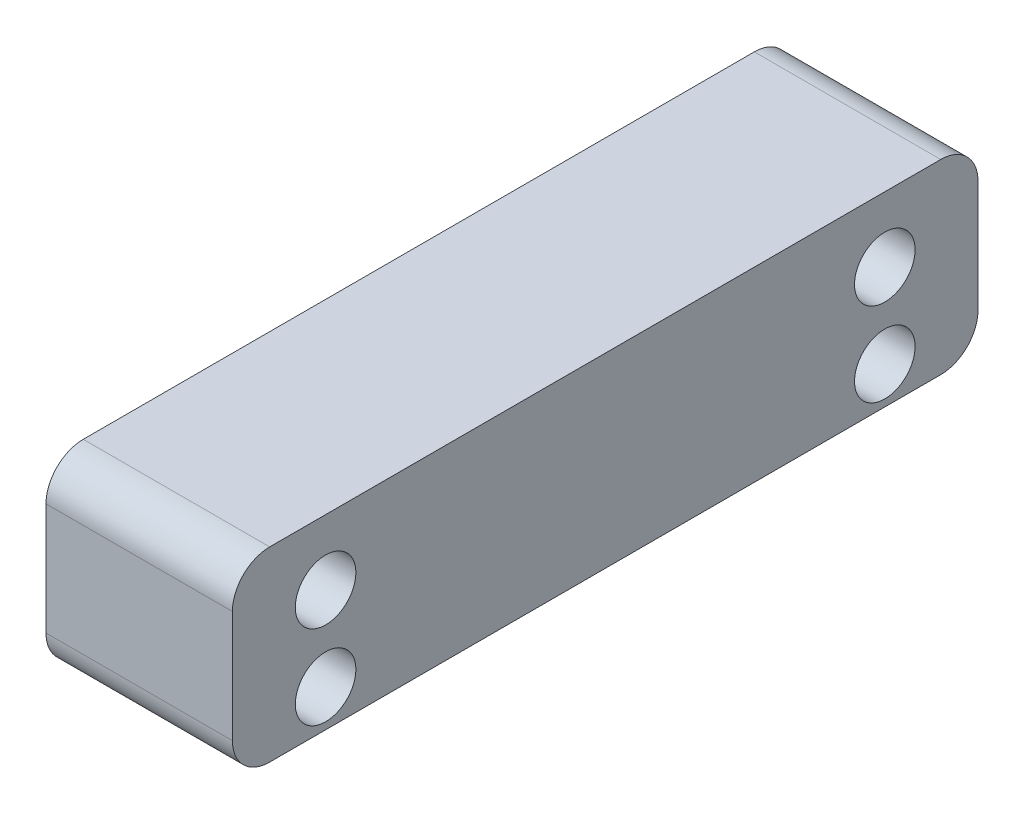
ISO-10303-21;
HEADER;
FILE_DESCRIPTION(('STEP AP214'),'2;1');
FILE_NAME('part.step','',(''),(''),'','','');
FILE_SCHEMA(('AUTOMOTIVE_DESIGN { 1 0 10303 214 1 1 1 1 }'));
ENDSEC;
DATA;
#1=APPLICATION_CONTEXT('core data for automotive mechanical design processes');
#2=APPLICATION_PROTOCOL_DEFINITION('international standard','automotive_design',2000,#1);
#3=PRODUCT_CONTEXT('',#1,'mechanical');
#4=PRODUCT('Part','Part','',(#3));
#5=PRODUCT_RELATED_PRODUCT_CATEGORY('part','',(#4));
#6=PRODUCT_DEFINITION_FORMATION('','',#4);
#7=PRODUCT_DEFINITION_CONTEXT('part definition',#1,'design');
#8=PRODUCT_DEFINITION('design','',#6,#7);
#9=PRODUCT_DEFINITION_SHAPE('','',#8);
#10=(LENGTH_UNIT() NAMED_UNIT(*) SI_UNIT(.MILLI.,.METRE.));
#11=(NAMED_UNIT(*) PLANE_ANGLE_UNIT() SI_UNIT($,.RADIAN.));
#12=(NAMED_UNIT(*) SI_UNIT($,.STERADIAN.) SOLID_ANGLE_UNIT());
#13=UNCERTAINTY_MEASURE_WITH_UNIT(LENGTH_MEASURE(1.E-05),#10,'distance_accuracy_value','');
#14=(GEOMETRIC_REPRESENTATION_CONTEXT(3) GLOBAL_UNCERTAINTY_ASSIGNED_CONTEXT((#13)) GLOBAL_UNIT_ASSIGNED_CONTEXT((#10,
#11,#12)) REPRESENTATION_CONTEXT('',''));
#15=CARTESIAN_POINT('',(0.,0.,0.));
#16=DIRECTION('',(0.,0.,1.));
#17=DIRECTION('',(1.,0.,0.));
#18=AXIS2_PLACEMENT_3D('',#15,#16,#17);
#19=CARTESIAN_POINT('',(-34.,0.,0.));
#20=DIRECTION('',(1.,0.,0.));
#21=DIRECTION('',(0.,0.,-1.));
#22=AXIS2_PLACEMENT_3D('',#19,#20,#21);
#23=PLANE('',#22);
#24=CARTESIAN_POINT('',(-34.,59.5,89.6966991411007));
#25=DIRECTION('',(1.,0.,0.));
#26=DIRECTION('',(0.,0.,-1.));
#27=AXIS2_PLACEMENT_3D('',#24,#25,#26);
#28=CIRCLE('',#27,3.25000000000001);
#29=CARTESIAN_POINT('',(-34.,59.5,86.4466991411007));
#30=VERTEX_POINT('',#29);
#31=EDGE_CURVE('E225',#30,#30,#28,.T.);
#32=ORIENTED_EDGE('',*,*,#31,.F.);
#33=EDGE_LOOP('',(#32));
#34=FACE_BOUND('',#33,.T.);
#35=CARTESIAN_POINT('',(-34.,50.5,89.6966991411007));
#36=DIRECTION('',(1.,0.,0.));
#37=DIRECTION('',(0.,0.,-1.));
#38=AXIS2_PLACEMENT_3D('',#35,#36,#37);
#39=CIRCLE('',#38,3.25000000000001);
#40=CARTESIAN_POINT('',(-34.,50.5,86.4466991411007));
#41=VERTEX_POINT('',#40);
#42=EDGE_CURVE('E212',#41,#41,#39,.T.);
#43=ORIENTED_EDGE('',*,*,#42,.F.);
#44=EDGE_LOOP('',(#43));
#45=FACE_BOUND('',#44,.T.);
#46=DIRECTION('',(0.,1.,0.));
#47=VECTOR('',#46,1.);
#48=CARTESIAN_POINT('',(-34.,45.,19.6966991411007));
#49=LINE('',#48,#47);
#50=CARTESIAN_POINT('',(-34.,50.5,19.6966991411007));
#51=VERTEX_POINT('',#50);
#52=CARTESIAN_POINT('',(-34.,62.5,19.6966991411007));
#53=VERTEX_POINT('',#52);
#54=EDGE_CURVE('E180',#51,#53,#49,.T.);
#55=ORIENTED_EDGE('',*,*,#54,.T.);
#56=CARTESIAN_POINT('',(-34.,62.5,23.6966991411007));
#57=DIRECTION('',(1.,0.,0.));
#58=DIRECTION('',(0.,0.,-1.));
#59=AXIS2_PLACEMENT_3D('',#56,#57,#58);
#60=CIRCLE('',#59,4.);
#61=CARTESIAN_POINT('',(-34.,66.5,23.6966991411007));
#62=VERTEX_POINT('',#61);
#63=EDGE_CURVE('E197',#53,#62,#60,.T.);
#64=ORIENTED_EDGE('',*,*,#63,.T.);
#65=DIRECTION('',(0.,0.,1.));
#66=VECTOR('',#65,1.);
#67=CARTESIAN_POINT('',(-34.,66.5,19.6966991411007));
#68=LINE('',#67,#66);
#69=CARTESIAN_POINT('',(-34.,66.5,95.6966991411007));
#70=VERTEX_POINT('',#69);
#71=EDGE_CURVE('E163',#62,#70,#68,.T.);
#72=ORIENTED_EDGE('',*,*,#71,.T.);
#73=CARTESIAN_POINT('',(-34.,62.5,95.6966991411007));
#74=DIRECTION('',(1.,0.,0.));
#75=DIRECTION('',(0.,0.,-1.));
#76=AXIS2_PLACEMENT_3D('',#73,#74,#75);
#77=CIRCLE('',#76,4.);
#78=CARTESIAN_POINT('',(-34.,62.5,99.6966991411007));
#79=VERTEX_POINT('',#78);
#80=EDGE_CURVE('E192',#70,#79,#77,.T.);
#81=ORIENTED_EDGE('',*,*,#80,.T.);
#82=DIRECTION('',(0.,-1.,0.));
#83=VECTOR('',#82,1.);
#84=CARTESIAN_POINT('',(-34.,65.,99.6966991411007));
#85=LINE('',#84,#83);
#86=CARTESIAN_POINT('',(-34.,50.5,99.6966991411007));
#87=VERTEX_POINT('',#86);
#88=EDGE_CURVE('E170',#79,#87,#85,.T.);
#89=ORIENTED_EDGE('',*,*,#88,.T.);
#90=CARTESIAN_POINT('',(-34.,50.5,95.6966991411007));
#91=DIRECTION('',(1.,0.,0.));
#92=DIRECTION('',(0.,0.,-1.));
#93=AXIS2_PLACEMENT_3D('',#90,#91,#92);
#94=CIRCLE('',#93,4.);
#95=CARTESIAN_POINT('',(-34.,46.5,95.6966991411007));
#96=VERTEX_POINT('',#95);
#97=EDGE_CURVE('E99',#87,#96,#94,.T.);
#98=ORIENTED_EDGE('',*,*,#97,.T.);
#99=DIRECTION('',(0.,0.,-1.));
#100=VECTOR('',#99,1.);
#101=CARTESIAN_POINT('',(-34.,46.5,99.6966991411007));
#102=LINE('',#101,#100);
#103=CARTESIAN_POINT('',(-34.,46.5,23.6966991411007));
#104=VERTEX_POINT('',#103);
#105=EDGE_CURVE('E173',#96,#104,#102,.T.);
#106=ORIENTED_EDGE('',*,*,#105,.T.);
#107=CARTESIAN_POINT('',(-34.,50.5,23.6966991411007));
#108=DIRECTION('',(1.,0.,0.));
#109=DIRECTION('',(0.,0.,-1.));
#110=AXIS2_PLACEMENT_3D('',#107,#108,#109);
#111=CIRCLE('',#110,4.);
#112=EDGE_CURVE('E195',#104,#51,#111,.T.);
#113=ORIENTED_EDGE('',*,*,#112,.T.);
#114=EDGE_LOOP('',(#55,#64,#72,#81,#89,#98,#106,#113));
#115=FACE_BOUND('',#114,.T.);
#116=CARTESIAN_POINT('',(-34.,59.5,29.6966991411007));
#117=DIRECTION('',(1.,0.,0.));
#118=DIRECTION('',(0.,0.,-1.));
#119=AXIS2_PLACEMENT_3D('',#116,#117,#118);
#120=CIRCLE('',#119,3.25);
#121=CARTESIAN_POINT('',(-34.,59.5,26.4466991411007));
#122=VERTEX_POINT('',#121);
#123=EDGE_CURVE('E220',#122,#122,#120,.T.);
#124=ORIENTED_EDGE('',*,*,#123,.F.);
#125=EDGE_LOOP('',(#124));
#126=FACE_BOUND('',#125,.T.);
#127=CARTESIAN_POINT('',(-34.,50.5,29.6966991411007));
#128=DIRECTION('',(1.,0.,0.));
#129=DIRECTION('',(0.,0.,-1.));
#130=AXIS2_PLACEMENT_3D('',#127,#128,#129);
#131=CIRCLE('',#130,3.25);
#132=CARTESIAN_POINT('',(-34.,50.5,26.4466991411007));
#133=VERTEX_POINT('',#132);
#134=EDGE_CURVE('E231',#133,#133,#131,.T.);
#135=ORIENTED_EDGE('',*,*,#134,.F.);
#136=EDGE_LOOP('',(#135));
#137=FACE_BOUND('',#136,.T.);
#138=ADVANCED_FACE('F77',(#34,#45,#115,#126,#137),#23,.T.);
#139=CARTESIAN_POINT('',(-54.,0.,0.));
#140=DIRECTION('',(1.,0.,0.));
#141=DIRECTION('',(0.,0.,-1.));
#142=AXIS2_PLACEMENT_3D('',#139,#140,#141);
#143=PLANE('',#142);
#144=DIRECTION('',(0.,0.,1.));
#145=VECTOR('',#144,1.);
#146=CARTESIAN_POINT('',(-54.,66.5,19.6966991411007));
#147=LINE('',#146,#145);
#148=CARTESIAN_POINT('',(-54.,66.5,23.6966991411007));
#149=VERTEX_POINT('',#148);
#150=CARTESIAN_POINT('',(-54.,66.5,95.6966991411007));
#151=VERTEX_POINT('',#150);
#152=EDGE_CURVE('E160',#149,#151,#147,.T.);
#153=ORIENTED_EDGE('',*,*,#152,.F.);
#154=CARTESIAN_POINT('',(-54.,62.5,23.6966991411007));
#155=DIRECTION('',(1.,0.,0.));
#156=DIRECTION('',(0.,0.,-1.));
#157=AXIS2_PLACEMENT_3D('',#154,#155,#156);
#158=CIRCLE('',#157,4.);
#159=CARTESIAN_POINT('',(-54.,62.5,19.6966991411007));
#160=VERTEX_POINT('',#159);
#161=EDGE_CURVE('E143',#149,#160,#158,.F.);
#162=ORIENTED_EDGE('',*,*,#161,.T.);
#163=DIRECTION('',(0.,1.,0.));
#164=VECTOR('',#163,1.);
#165=CARTESIAN_POINT('',(-54.,45.,19.6966991411007));
#166=LINE('',#165,#164);
#167=CARTESIAN_POINT('',(-54.,50.5,19.6966991411007));
#168=VERTEX_POINT('',#167);
#169=EDGE_CURVE('E171',#168,#160,#166,.T.);
#170=ORIENTED_EDGE('',*,*,#169,.F.);
#171=CARTESIAN_POINT('',(-54.,50.5,23.6966991411007));
#172=DIRECTION('',(1.,0.,0.));
#173=DIRECTION('',(0.,0.,-1.));
#174=AXIS2_PLACEMENT_3D('',#171,#172,#173);
#175=CIRCLE('',#174,4.);
#176=CARTESIAN_POINT('',(-54.,46.5,23.6966991411007));
#177=VERTEX_POINT('',#176);
#178=EDGE_CURVE('E154',#168,#177,#175,.F.);
#179=ORIENTED_EDGE('',*,*,#178,.T.);
#180=DIRECTION('',(0.,0.,-1.));
#181=VECTOR('',#180,1.);
#182=CARTESIAN_POINT('',(-54.,46.5,99.6966991411007));
#183=LINE('',#182,#181);
#184=CARTESIAN_POINT('',(-54.,46.5,95.6966991411007));
#185=VERTEX_POINT('',#184);
#186=EDGE_CURVE('E175',#185,#177,#183,.T.);
#187=ORIENTED_EDGE('',*,*,#186,.F.);
#188=CARTESIAN_POINT('',(-54.,50.5,95.6966991411007));
#189=DIRECTION('',(1.,0.,0.));
#190=DIRECTION('',(0.,0.,-1.));
#191=AXIS2_PLACEMENT_3D('',#188,#189,#190);
#192=CIRCLE('',#191,4.);
#193=CARTESIAN_POINT('',(-54.,50.5,99.6966991411007));
#194=VERTEX_POINT('',#193);
#195=EDGE_CURVE('E186',#185,#194,#192,.F.);
#196=ORIENTED_EDGE('',*,*,#195,.T.);
#197=DIRECTION('',(0.,-1.,0.));
#198=VECTOR('',#197,1.);
#199=CARTESIAN_POINT('',(-54.,65.,99.6966991411007));
#200=LINE('',#199,#198);
#201=CARTESIAN_POINT('',(-54.,62.5,99.6966991411007));
#202=VERTEX_POINT('',#201);
#203=EDGE_CURVE('E182',#202,#194,#200,.T.);
#204=ORIENTED_EDGE('',*,*,#203,.F.);
#205=CARTESIAN_POINT('',(-54.,62.5,95.6966991411007));
#206=DIRECTION('',(1.,0.,0.));
#207=DIRECTION('',(0.,0.,-1.));
#208=AXIS2_PLACEMENT_3D('',#205,#206,#207);
#209=CIRCLE('',#208,4.);
#210=EDGE_CURVE('E164',#202,#151,#209,.F.);
#211=ORIENTED_EDGE('',*,*,#210,.T.);
#212=EDGE_LOOP('',(#153,#162,#170,#179,#187,#196,#204,#211));
#213=FACE_BOUND('',#212,.T.);
#214=CARTESIAN_POINT('',(-54.,50.5,89.6966991411007));
#215=DIRECTION('',(1.,0.,0.));
#216=DIRECTION('',(0.,0.,-1.));
#217=AXIS2_PLACEMENT_3D('',#214,#215,#216);
#218=CIRCLE('',#217,3.25000000000001);
#219=CARTESIAN_POINT('',(-54.,50.5,86.4466991411007));
#220=VERTEX_POINT('',#219);
#221=EDGE_CURVE('E214',#220,#220,#218,.T.);
#222=ORIENTED_EDGE('',*,*,#221,.T.);
#223=EDGE_LOOP('',(#222));
#224=FACE_BOUND('',#223,.T.);
#225=CARTESIAN_POINT('',(-54.,59.5,29.6966991411007));
#226=DIRECTION('',(1.,0.,0.));
#227=DIRECTION('',(0.,0.,-1.));
#228=AXIS2_PLACEMENT_3D('',#225,#226,#227);
#229=CIRCLE('',#228,3.25);
#230=CARTESIAN_POINT('',(-54.,59.5,26.4466991411007));
#231=VERTEX_POINT('',#230);
#232=EDGE_CURVE('E222',#231,#231,#229,.T.);
#233=ORIENTED_EDGE('',*,*,#232,.T.);
#234=EDGE_LOOP('',(#233));
#235=FACE_BOUND('',#234,.T.);
#236=CARTESIAN_POINT('',(-54.,59.5,89.6966991411007));
#237=DIRECTION('',(1.,0.,0.));
#238=DIRECTION('',(0.,0.,-1.));
#239=AXIS2_PLACEMENT_3D('',#236,#237,#238);
#240=CIRCLE('',#239,3.25000000000001);
#241=CARTESIAN_POINT('',(-54.,59.5,86.4466991411007));
#242=VERTEX_POINT('',#241);
#243=EDGE_CURVE('E228',#242,#242,#240,.T.);
#244=ORIENTED_EDGE('',*,*,#243,.T.);
#245=EDGE_LOOP('',(#244));
#246=FACE_BOUND('',#245,.T.);
#247=CARTESIAN_POINT('',(-54.,50.5,29.6966991411007));
#248=DIRECTION('',(1.,0.,0.));
#249=DIRECTION('',(0.,0.,-1.));
#250=AXIS2_PLACEMENT_3D('',#247,#248,#249);
#251=CIRCLE('',#250,3.25);
#252=CARTESIAN_POINT('',(-54.,50.5,26.4466991411007));
#253=VERTEX_POINT('',#252);
#254=EDGE_CURVE('E234',#253,#253,#251,.T.);
#255=ORIENTED_EDGE('',*,*,#254,.T.);
#256=EDGE_LOOP('',(#255));
#257=FACE_BOUND('',#256,.T.);
#258=ADVANCED_FACE('F167',(#213,#224,#235,#246,#257),#143,.F.);
#259=CARTESIAN_POINT('',(-34.,65.,99.6966991411007));
#260=DIRECTION('',(0.,0.,-1.));
#261=DIRECTION('',(-1.,0.,0.));
#262=AXIS2_PLACEMENT_3D('',#259,#260,#261);
#263=PLANE('',#262);
#264=ORIENTED_EDGE('',*,*,#203,.T.);
#265=DIRECTION('',(-1.,0.,0.));
#266=VECTOR('',#265,1.);
#267=CARTESIAN_POINT('',(-34.,50.5,99.6966991411007));
#268=LINE('',#267,#266);
#269=EDGE_CURVE('E13',#194,#87,#268,.F.);
#270=ORIENTED_EDGE('',*,*,#269,.T.);
#271=ORIENTED_EDGE('',*,*,#88,.F.);
#272=DIRECTION('',(-1.,0.,0.));
#273=VECTOR('',#272,1.);
#274=CARTESIAN_POINT('',(-34.,62.5,99.6966991411007));
#275=LINE('',#274,#273);
#276=EDGE_CURVE('E85',#79,#202,#275,.T.);
#277=ORIENTED_EDGE('',*,*,#276,.T.);
#278=EDGE_LOOP('',(#264,#270,#271,#277));
#279=FACE_BOUND('',#278,.T.);
#280=ADVANCED_FACE('F207',(#279),#263,.F.);
#281=CARTESIAN_POINT('',(-34.,46.5,99.6966991411007));
#282=DIRECTION('',(0.,1.,0.));
#283=DIRECTION('',(0.,0.,1.));
#284=AXIS2_PLACEMENT_3D('',#281,#282,#283);
#285=PLANE('',#284);
#286=ORIENTED_EDGE('',*,*,#186,.T.);
#287=DIRECTION('',(-1.,0.,0.));
#288=VECTOR('',#287,1.);
#289=CARTESIAN_POINT('',(-34.,46.5,23.6966991411007));
#290=LINE('',#289,#288);
#291=EDGE_CURVE('E92',#177,#104,#290,.F.);
#292=ORIENTED_EDGE('',*,*,#291,.T.);
#293=ORIENTED_EDGE('',*,*,#105,.F.);
#294=DIRECTION('',(-1.,0.,0.));
#295=VECTOR('',#294,1.);
#296=CARTESIAN_POINT('',(-34.,46.5,95.6966991411007));
#297=LINE('',#296,#295);
#298=EDGE_CURVE('E199',#96,#185,#297,.T.);
#299=ORIENTED_EDGE('',*,*,#298,.T.);
#300=EDGE_LOOP('',(#286,#292,#293,#299));
#301=FACE_BOUND('',#300,.T.);
#302=ADVANCED_FACE('F259',(#301),#285,.F.);
#303=CARTESIAN_POINT('',(-34.,45.,19.6966991411007));
#304=DIRECTION('',(0.,0.,1.));
#305=DIRECTION('',(1.,0.,0.));
#306=AXIS2_PLACEMENT_3D('',#303,#304,#305);
#307=PLANE('',#306);
#308=ORIENTED_EDGE('',*,*,#169,.T.);
#309=DIRECTION('',(-1.,0.,0.));
#310=VECTOR('',#309,1.);
#311=CARTESIAN_POINT('',(-34.,62.5,19.6966991411007));
#312=LINE('',#311,#310);
#313=EDGE_CURVE('E148',#160,#53,#312,.F.);
#314=ORIENTED_EDGE('',*,*,#313,.T.);
#315=ORIENTED_EDGE('',*,*,#54,.F.);
#316=DIRECTION('',(-1.,0.,0.));
#317=VECTOR('',#316,1.);
#318=CARTESIAN_POINT('',(-34.,50.5,19.6966991411007));
#319=LINE('',#318,#317);
#320=EDGE_CURVE('E153',#51,#168,#319,.T.);
#321=ORIENTED_EDGE('',*,*,#320,.T.);
#322=EDGE_LOOP('',(#308,#314,#315,#321));
#323=FACE_BOUND('',#322,.T.);
#324=ADVANCED_FACE('F256',(#323),#307,.F.);
#325=CARTESIAN_POINT('',(-34.,66.5,19.6966991411007));
#326=DIRECTION('',(0.,-1.,0.));
#327=DIRECTION('',(0.,0.,-1.));
#328=AXIS2_PLACEMENT_3D('',#325,#326,#327);
#329=PLANE('',#328);
#330=ORIENTED_EDGE('',*,*,#71,.F.);
#331=DIRECTION('',(-1.,0.,0.));
#332=VECTOR('',#331,1.);
#333=CARTESIAN_POINT('',(-34.,66.5,23.6966991411007));
#334=LINE('',#333,#332);
#335=EDGE_CURVE('E147',#62,#149,#334,.T.);
#336=ORIENTED_EDGE('',*,*,#335,.T.);
#337=ORIENTED_EDGE('',*,*,#152,.T.);
#338=DIRECTION('',(-1.,0.,0.));
#339=VECTOR('',#338,1.);
#340=CARTESIAN_POINT('',(-34.,66.5,95.6966991411007));
#341=LINE('',#340,#339);
#342=EDGE_CURVE('E165',#151,#70,#341,.F.);
#343=ORIENTED_EDGE('',*,*,#342,.T.);
#344=EDGE_LOOP('',(#330,#336,#337,#343));
#345=FACE_BOUND('',#344,.T.);
#346=ADVANCED_FACE('F159',(#345),#329,.F.);
#347=CARTESIAN_POINT('',(-34.,50.5,89.6966991411007));
#348=DIRECTION('',(-1.,0.,0.));
#349=DIRECTION('',(0.,0.,1.));
#350=AXIS2_PLACEMENT_3D('',#347,#348,#349);
#351=CYLINDRICAL_SURFACE('',#350,3.25000000000001);
#352=ORIENTED_EDGE('',*,*,#42,.T.);
#353=EDGE_LOOP('',(#352));
#354=FACE_BOUND('',#353,.T.);
#355=ORIENTED_EDGE('',*,*,#221,.F.);
#356=EDGE_LOOP('',(#355));
#357=FACE_BOUND('',#356,.T.);
#358=ADVANCED_FACE('F253',(#354,#357),#351,.F.);
#359=CARTESIAN_POINT('',(-34.,59.5,29.6966991411007));
#360=DIRECTION('',(-1.,0.,0.));
#361=DIRECTION('',(0.,0.,1.));
#362=AXIS2_PLACEMENT_3D('',#359,#360,#361);
#363=CYLINDRICAL_SURFACE('',#362,3.25);
#364=ORIENTED_EDGE('',*,*,#123,.T.);
#365=EDGE_LOOP('',(#364));
#366=FACE_BOUND('',#365,.T.);
#367=ORIENTED_EDGE('',*,*,#232,.F.);
#368=EDGE_LOOP('',(#367));
#369=FACE_BOUND('',#368,.T.);
#370=ADVANCED_FACE('F285',(#366,#369),#363,.F.);
#371=CARTESIAN_POINT('',(-34.,59.5,89.6966991411007));
#372=DIRECTION('',(-1.,0.,0.));
#373=DIRECTION('',(0.,0.,1.));
#374=AXIS2_PLACEMENT_3D('',#371,#372,#373);
#375=CYLINDRICAL_SURFACE('',#374,3.25000000000001);
#376=ORIENTED_EDGE('',*,*,#31,.T.);
#377=EDGE_LOOP('',(#376));
#378=FACE_BOUND('',#377,.T.);
#379=ORIENTED_EDGE('',*,*,#243,.F.);
#380=EDGE_LOOP('',(#379));
#381=FACE_BOUND('',#380,.T.);
#382=ADVANCED_FACE('F288',(#378,#381),#375,.F.);
#383=CARTESIAN_POINT('',(-34.,50.5,29.6966991411007));
#384=DIRECTION('',(-1.,0.,0.));
#385=DIRECTION('',(0.,0.,1.));
#386=AXIS2_PLACEMENT_3D('',#383,#384,#385);
#387=CYLINDRICAL_SURFACE('',#386,3.25);
#388=ORIENTED_EDGE('',*,*,#134,.T.);
#389=EDGE_LOOP('',(#388));
#390=FACE_BOUND('',#389,.T.);
#391=ORIENTED_EDGE('',*,*,#254,.F.);
#392=EDGE_LOOP('',(#391));
#393=FACE_BOUND('',#392,.T.);
#394=ADVANCED_FACE('F240',(#390,#393),#387,.F.);
#395=CARTESIAN_POINT('',(-34.,62.5,23.6966991411007));
#396=DIRECTION('',(-1.,0.,0.));
#397=DIRECTION('',(0.,0.,1.));
#398=AXIS2_PLACEMENT_3D('',#395,#396,#397);
#399=CYLINDRICAL_SURFACE('',#398,4.);
#400=ORIENTED_EDGE('',*,*,#63,.F.);
#401=ORIENTED_EDGE('',*,*,#313,.F.);
#402=ORIENTED_EDGE('',*,*,#161,.F.);
#403=ORIENTED_EDGE('',*,*,#335,.F.);
#404=EDGE_LOOP('',(#400,#401,#402,#403));
#405=FACE_BOUND('',#404,.T.);
#406=ADVANCED_FACE('F146',(#405),#399,.T.);
#407=CARTESIAN_POINT('',(-34.,50.5,23.6966991411007));
#408=DIRECTION('',(-1.,0.,0.));
#409=DIRECTION('',(0.,0.,1.));
#410=AXIS2_PLACEMENT_3D('',#407,#408,#409);
#411=CYLINDRICAL_SURFACE('',#410,4.);
#412=ORIENTED_EDGE('',*,*,#112,.F.);
#413=ORIENTED_EDGE('',*,*,#291,.F.);
#414=ORIENTED_EDGE('',*,*,#178,.F.);
#415=ORIENTED_EDGE('',*,*,#320,.F.);
#416=EDGE_LOOP('',(#412,#413,#414,#415));
#417=FACE_BOUND('',#416,.T.);
#418=ADVANCED_FACE('F269',(#417),#411,.T.);
#419=CARTESIAN_POINT('',(-34.,50.5,95.6966991411007));
#420=DIRECTION('',(-1.,0.,0.));
#421=DIRECTION('',(0.,0.,1.));
#422=AXIS2_PLACEMENT_3D('',#419,#420,#421);
#423=CYLINDRICAL_SURFACE('',#422,4.);
#424=ORIENTED_EDGE('',*,*,#97,.F.);
#425=ORIENTED_EDGE('',*,*,#269,.F.);
#426=ORIENTED_EDGE('',*,*,#195,.F.);
#427=ORIENTED_EDGE('',*,*,#298,.F.);
#428=EDGE_LOOP('',(#424,#425,#426,#427));
#429=FACE_BOUND('',#428,.T.);
#430=ADVANCED_FACE('F271',(#429),#423,.T.);
#431=CARTESIAN_POINT('',(-34.,62.5,95.6966991411007));
#432=DIRECTION('',(-1.,0.,0.));
#433=DIRECTION('',(0.,0.,1.));
#434=AXIS2_PLACEMENT_3D('',#431,#432,#433);
#435=CYLINDRICAL_SURFACE('',#434,4.);
#436=ORIENTED_EDGE('',*,*,#80,.F.);
#437=ORIENTED_EDGE('',*,*,#342,.F.);
#438=ORIENTED_EDGE('',*,*,#210,.F.);
#439=ORIENTED_EDGE('',*,*,#276,.F.);
#440=EDGE_LOOP('',(#436,#437,#438,#439));
#441=FACE_BOUND('',#440,.T.);
#442=ADVANCED_FACE('F79',(#441),#435,.T.);
#443=CLOSED_SHELL('',(#138,#258,#280,#302,#324,#346,#358,#370,#382,#394,#406,#418,#430,#442));
#444=MANIFOLD_SOLID_BREP('B2',#443);
#445=ADVANCED_BREP_SHAPE_REPRESENTATION('',(#18,#444),#14);
#446=SHAPE_DEFINITION_REPRESENTATION(#9,#445);
ENDSEC;
END-ISO-10303-21;
